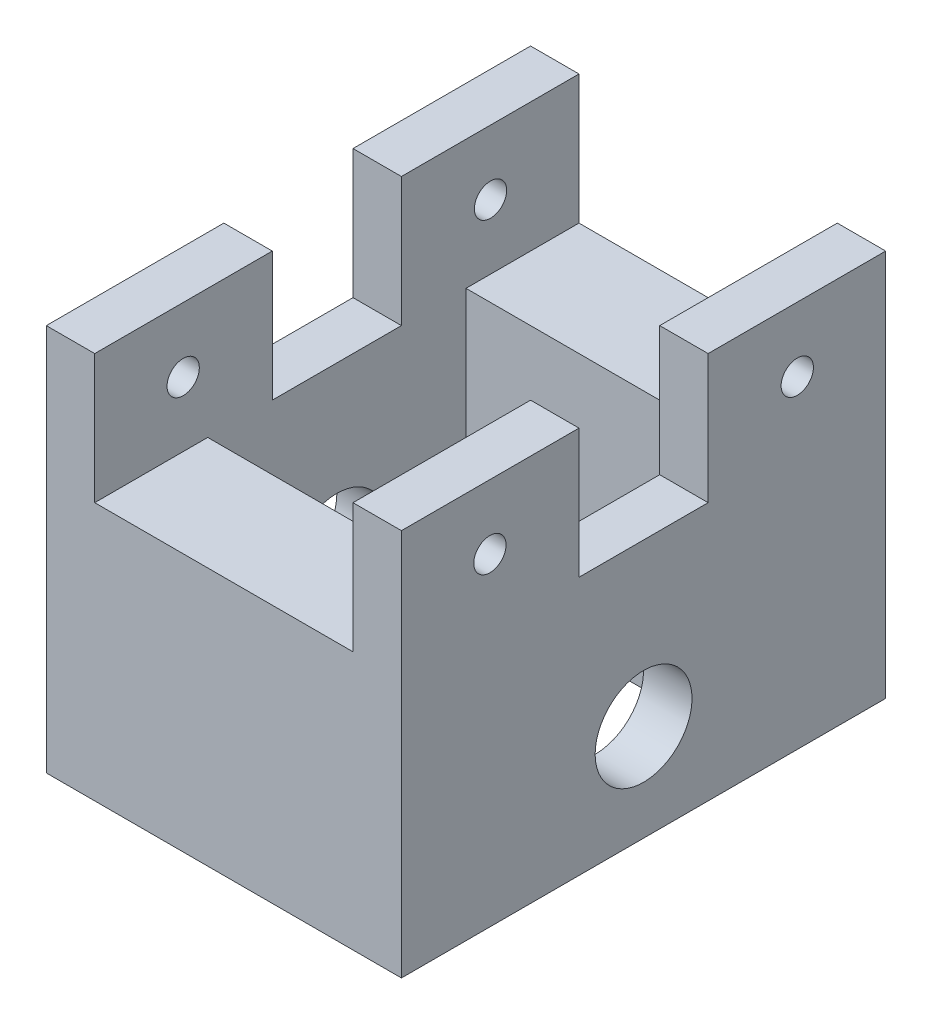
ISO-10303-21;
HEADER;
FILE_DESCRIPTION(('STEP AP214'),'2;1');
FILE_NAME('part.step','',(''),(''),'','','');
FILE_SCHEMA(('AUTOMOTIVE_DESIGN { 1 0 10303 214 1 1 1 1 }'));
ENDSEC;
DATA;
#1=APPLICATION_CONTEXT('core data for automotive mechanical design processes');
#2=APPLICATION_PROTOCOL_DEFINITION('international standard','automotive_design',2000,#1);
#3=PRODUCT_CONTEXT('',#1,'mechanical');
#4=PRODUCT('Part','Part','',(#3));
#5=PRODUCT_RELATED_PRODUCT_CATEGORY('part','',(#4));
#6=PRODUCT_DEFINITION_FORMATION('','',#4);
#7=PRODUCT_DEFINITION_CONTEXT('part definition',#1,'design');
#8=PRODUCT_DEFINITION('design','',#6,#7);
#9=PRODUCT_DEFINITION_SHAPE('','',#8);
#10=(LENGTH_UNIT() NAMED_UNIT(*) SI_UNIT(.MILLI.,.METRE.));
#11=(NAMED_UNIT(*) PLANE_ANGLE_UNIT() SI_UNIT($,.RADIAN.));
#12=(NAMED_UNIT(*) SI_UNIT($,.STERADIAN.) SOLID_ANGLE_UNIT());
#13=UNCERTAINTY_MEASURE_WITH_UNIT(LENGTH_MEASURE(1.E-05),#10,'distance_accuracy_value','');
#14=(GEOMETRIC_REPRESENTATION_CONTEXT(3) GLOBAL_UNCERTAINTY_ASSIGNED_CONTEXT((#13)) GLOBAL_UNIT_ASSIGNED_CONTEXT((#10,
#11,#12)) REPRESENTATION_CONTEXT('',''));
#15=CARTESIAN_POINT('',(0.,0.,0.));
#16=DIRECTION('',(0.,0.,1.));
#17=DIRECTION('',(1.,0.,0.));
#18=AXIS2_PLACEMENT_3D('',#15,#16,#17);
#19=CARTESIAN_POINT('',(0.,152.4,0.));
#20=DIRECTION('',(0.,1.,0.));
#21=DIRECTION('',(0.,0.,1.));
#22=AXIS2_PLACEMENT_3D('',#19,#20,#21);
#23=PLANE('',#22);
#24=DIRECTION('',(-1.,0.,0.));
#25=VECTOR('',#24,1.);
#26=CARTESIAN_POINT('',(69.85,152.4,-25.4));
#27=LINE('',#26,#25);
#28=CARTESIAN_POINT('',(-50.8,152.4,-25.4));
#29=VERTEX_POINT('',#28);
#30=CARTESIAN_POINT('',(-69.85,152.4,-25.4));
#31=VERTEX_POINT('',#30);
#32=EDGE_CURVE('E384',#29,#31,#27,.T.);
#33=ORIENTED_EDGE('',*,*,#32,.F.);
#34=DIRECTION('',(0.,0.,1.));
#35=VECTOR('',#34,1.);
#36=CARTESIAN_POINT('',(-50.8,152.4,76.2));
#37=LINE('',#36,#35);
#38=CARTESIAN_POINT('',(-50.8,152.4,-95.25));
#39=VERTEX_POINT('',#38);
#40=EDGE_CURVE('E322',#39,#29,#37,.T.);
#41=ORIENTED_EDGE('',*,*,#40,.F.);
#42=DIRECTION('',(-1.,0.,0.));
#43=VECTOR('',#42,1.);
#44=CARTESIAN_POINT('',(0.,152.4,-95.25));
#45=LINE('',#44,#43);
#46=CARTESIAN_POINT('',(-69.85,152.4,-95.25));
#47=VERTEX_POINT('',#46);
#48=EDGE_CURVE('E333',#39,#47,#45,.T.);
#49=ORIENTED_EDGE('',*,*,#48,.T.);
#50=DIRECTION('',(0.,0.,1.));
#51=VECTOR('',#50,1.);
#52=CARTESIAN_POINT('',(-69.85,152.4,0.));
#53=LINE('',#52,#51);
#54=EDGE_CURVE('E338',#47,#31,#53,.T.);
#55=ORIENTED_EDGE('',*,*,#54,.T.);
#56=EDGE_LOOP('',(#33,#41,#49,#55));
#57=FACE_BOUND('',#56,.T.);
#58=ADVANCED_FACE('F65',(#57),#23,.T.);
#59=CARTESIAN_POINT('',(69.85,152.4,-25.4));
#60=VERTEX_POINT('',#59);
#61=CARTESIAN_POINT('',(50.8,152.4,-25.4));
#62=VERTEX_POINT('',#61);
#63=EDGE_CURVE('E216',#60,#62,#27,.T.);
#64=ORIENTED_EDGE('',*,*,#63,.F.);
#65=DIRECTION('',(0.,0.,-1.));
#66=VECTOR('',#65,1.);
#67=CARTESIAN_POINT('',(69.85,152.4,0.));
#68=LINE('',#67,#66);
#69=CARTESIAN_POINT('',(69.85,152.4,-95.25));
#70=VERTEX_POINT('',#69);
#71=EDGE_CURVE('E334',#60,#70,#68,.T.);
#72=ORIENTED_EDGE('',*,*,#71,.T.);
#73=CARTESIAN_POINT('',(50.8,152.4,-95.25));
#74=VERTEX_POINT('',#73);
#75=EDGE_CURVE('E335',#70,#74,#45,.T.);
#76=ORIENTED_EDGE('',*,*,#75,.T.);
#77=DIRECTION('',(0.,0.,-1.));
#78=VECTOR('',#77,1.);
#79=CARTESIAN_POINT('',(50.8,152.4,76.2));
#80=LINE('',#79,#78);
#81=EDGE_CURVE('E321',#62,#74,#80,.T.);
#82=ORIENTED_EDGE('',*,*,#81,.F.);
#83=EDGE_LOOP('',(#64,#72,#76,#82));
#84=FACE_BOUND('',#83,.T.);
#85=ADVANCED_FACE('F397',(#84),#23,.T.);
#86=DIRECTION('',(1.,0.,0.));
#87=VECTOR('',#86,1.);
#88=CARTESIAN_POINT('',(69.85,152.4,25.4));
#89=LINE('',#88,#87);
#90=CARTESIAN_POINT('',(-69.85,152.4,25.4));
#91=VERTEX_POINT('',#90);
#92=CARTESIAN_POINT('',(-50.8,152.4,25.4));
#93=VERTEX_POINT('',#92);
#94=EDGE_CURVE('E382',#91,#93,#89,.T.);
#95=ORIENTED_EDGE('',*,*,#94,.F.);
#96=CARTESIAN_POINT('',(-69.85,152.4,95.25));
#97=VERTEX_POINT('',#96);
#98=EDGE_CURVE('E222',#91,#97,#53,.T.);
#99=ORIENTED_EDGE('',*,*,#98,.T.);
#100=DIRECTION('',(1.,0.,0.));
#101=VECTOR('',#100,1.);
#102=CARTESIAN_POINT('',(0.,152.4,95.25));
#103=LINE('',#102,#101);
#104=CARTESIAN_POINT('',(-50.8,152.4,95.25));
#105=VERTEX_POINT('',#104);
#106=EDGE_CURVE('E342',#97,#105,#103,.T.);
#107=ORIENTED_EDGE('',*,*,#106,.T.);
#108=EDGE_CURVE('E320',#93,#105,#37,.T.);
#109=ORIENTED_EDGE('',*,*,#108,.F.);
#110=EDGE_LOOP('',(#95,#99,#107,#109));
#111=FACE_BOUND('',#110,.T.);
#112=ADVANCED_FACE('F454',(#111),#23,.T.);
#113=CARTESIAN_POINT('',(50.8,152.4,25.4));
#114=VERTEX_POINT('',#113);
#115=CARTESIAN_POINT('',(69.85,152.4,25.4));
#116=VERTEX_POINT('',#115);
#117=EDGE_CURVE('E385',#114,#116,#89,.T.);
#118=ORIENTED_EDGE('',*,*,#117,.F.);
#119=CARTESIAN_POINT('',(50.8,152.4,95.25));
#120=VERTEX_POINT('',#119);
#121=EDGE_CURVE('E317',#120,#114,#80,.T.);
#122=ORIENTED_EDGE('',*,*,#121,.F.);
#123=CARTESIAN_POINT('',(69.85,152.4,95.25));
#124=VERTEX_POINT('',#123);
#125=EDGE_CURVE('E341',#120,#124,#103,.T.);
#126=ORIENTED_EDGE('',*,*,#125,.T.);
#127=EDGE_CURVE('E330',#124,#116,#68,.T.);
#128=ORIENTED_EDGE('',*,*,#127,.T.);
#129=EDGE_LOOP('',(#118,#122,#126,#128));
#130=FACE_BOUND('',#129,.T.);
#131=ADVANCED_FACE('F442',(#130),#23,.T.);
#132=CARTESIAN_POINT('',(0.,0.,0.));
#133=DIRECTION('',(0.,1.,0.));
#134=DIRECTION('',(0.,0.,1.));
#135=AXIS2_PLACEMENT_3D('',#132,#133,#134);
#136=PLANE('',#135);
#137=DIRECTION('',(0.,0.,-1.));
#138=VECTOR('',#137,1.);
#139=CARTESIAN_POINT('',(50.8,0.,76.2));
#140=LINE('',#139,#138);
#141=CARTESIAN_POINT('',(50.8,0.,50.8));
#142=VERTEX_POINT('',#141);
#143=CARTESIAN_POINT('',(50.8,0.,-50.8));
#144=VERTEX_POINT('',#143);
#145=EDGE_CURVE('E316',#142,#144,#140,.T.);
#146=ORIENTED_EDGE('',*,*,#145,.T.);
#147=DIRECTION('',(-1.,0.,0.));
#148=VECTOR('',#147,1.);
#149=CARTESIAN_POINT('',(-50.8,0.,-50.8));
#150=LINE('',#149,#148);
#151=CARTESIAN_POINT('',(-50.8,0.,-50.8));
#152=VERTEX_POINT('',#151);
#153=EDGE_CURVE('E243',#144,#152,#150,.T.);
#154=ORIENTED_EDGE('',*,*,#153,.T.);
#155=DIRECTION('',(0.,0.,1.));
#156=VECTOR('',#155,1.);
#157=CARTESIAN_POINT('',(-50.8,0.,76.2));
#158=LINE('',#157,#156);
#159=CARTESIAN_POINT('',(-50.8,0.,50.8));
#160=VERTEX_POINT('',#159);
#161=EDGE_CURVE('E328',#152,#160,#158,.T.);
#162=ORIENTED_EDGE('',*,*,#161,.T.);
#163=DIRECTION('',(1.,0.,0.));
#164=VECTOR('',#163,1.);
#165=CARTESIAN_POINT('',(-50.8,0.,50.8));
#166=LINE('',#165,#164);
#167=EDGE_CURVE('E250',#160,#142,#166,.T.);
#168=ORIENTED_EDGE('',*,*,#167,.T.);
#169=EDGE_LOOP('',(#146,#154,#162,#168));
#170=FACE_BOUND('',#169,.T.);
#171=DIRECTION('',(0.,0.,1.));
#172=VECTOR('',#171,1.);
#173=CARTESIAN_POINT('',(-69.85,0.,0.));
#174=LINE('',#173,#172);
#175=CARTESIAN_POINT('',(-69.85,0.,-95.25));
#176=VERTEX_POINT('',#175);
#177=CARTESIAN_POINT('',(-69.85,0.,95.25));
#178=VERTEX_POINT('',#177);
#179=EDGE_CURVE('E350',#176,#178,#174,.T.);
#180=ORIENTED_EDGE('',*,*,#179,.F.);
#181=DIRECTION('',(-1.,0.,0.));
#182=VECTOR('',#181,1.);
#183=CARTESIAN_POINT('',(0.,0.,-95.25));
#184=LINE('',#183,#182);
#185=CARTESIAN_POINT('',(69.85,0.,-95.25));
#186=VERTEX_POINT('',#185);
#187=EDGE_CURVE('E348',#186,#176,#184,.T.);
#188=ORIENTED_EDGE('',*,*,#187,.F.);
#189=DIRECTION('',(0.,0.,-1.));
#190=VECTOR('',#189,1.);
#191=CARTESIAN_POINT('',(69.85,0.,0.));
#192=LINE('',#191,#190);
#193=CARTESIAN_POINT('',(69.85,0.,95.25));
#194=VERTEX_POINT('',#193);
#195=EDGE_CURVE('E325',#194,#186,#192,.T.);
#196=ORIENTED_EDGE('',*,*,#195,.F.);
#197=DIRECTION('',(1.,0.,0.));
#198=VECTOR('',#197,1.);
#199=CARTESIAN_POINT('',(0.,0.,95.25));
#200=LINE('',#199,#198);
#201=EDGE_CURVE('E352',#178,#194,#200,.T.);
#202=ORIENTED_EDGE('',*,*,#201,.F.);
#203=EDGE_LOOP('',(#180,#188,#196,#202));
#204=FACE_BOUND('',#203,.T.);
#205=ADVANCED_FACE('F422',(#170,#204),#136,.F.);
#206=CARTESIAN_POINT('',(69.85,152.4,0.));
#207=DIRECTION('',(-1.,0.,0.));
#208=DIRECTION('',(0.,0.,1.));
#209=AXIS2_PLACEMENT_3D('',#206,#207,#208);
#210=PLANE('',#209);
#211=ORIENTED_EDGE('',*,*,#71,.F.);
#212=DIRECTION('',(0.,1.,0.));
#213=VECTOR('',#212,1.);
#214=CARTESIAN_POINT('',(69.85,101.6,-25.4));
#215=LINE('',#214,#213);
#216=CARTESIAN_POINT('',(69.85,101.6,-25.4));
#217=VERTEX_POINT('',#216);
#218=EDGE_CURVE('E226',#217,#60,#215,.T.);
#219=ORIENTED_EDGE('',*,*,#218,.F.);
#220=DIRECTION('',(0.,0.,-1.));
#221=VECTOR('',#220,1.);
#222=CARTESIAN_POINT('',(69.85,101.6,25.4));
#223=LINE('',#222,#221);
#224=CARTESIAN_POINT('',(69.85,101.6,25.4));
#225=VERTEX_POINT('',#224);
#226=EDGE_CURVE('E205',#225,#217,#223,.T.);
#227=ORIENTED_EDGE('',*,*,#226,.F.);
#228=DIRECTION('',(0.,1.,0.));
#229=VECTOR('',#228,1.);
#230=CARTESIAN_POINT('',(69.85,101.6,25.4));
#231=LINE('',#230,#229);
#232=EDGE_CURVE('E223',#225,#116,#231,.T.);
#233=ORIENTED_EDGE('',*,*,#232,.T.);
#234=ORIENTED_EDGE('',*,*,#127,.F.);
#235=DIRECTION('',(0.,-1.,0.));
#236=VECTOR('',#235,1.);
#237=CARTESIAN_POINT('',(69.85,152.4,95.25));
#238=LINE('',#237,#236);
#239=EDGE_CURVE('E345',#124,#194,#238,.T.);
#240=ORIENTED_EDGE('',*,*,#239,.T.);
#241=ORIENTED_EDGE('',*,*,#195,.T.);
#242=DIRECTION('',(0.,-1.,0.));
#243=VECTOR('',#242,1.);
#244=CARTESIAN_POINT('',(69.85,152.4,-95.25));
#245=LINE('',#244,#243);
#246=EDGE_CURVE('E362',#70,#186,#245,.T.);
#247=ORIENTED_EDGE('',*,*,#246,.F.);
#248=EDGE_LOOP('',(#211,#219,#227,#233,#234,#240,#241,#247));
#249=FACE_BOUND('',#248,.T.);
#250=CARTESIAN_POINT('',(69.85,127.,60.452));
#251=DIRECTION('',(1.,0.,0.));
#252=DIRECTION('',(0.,0.,-1.));
#253=AXIS2_PLACEMENT_3D('',#250,#251,#252);
#254=CIRCLE('',#253,6.34999999999999);
#255=CARTESIAN_POINT('',(69.85,127.,54.102));
#256=VERTEX_POINT('',#255);
#257=EDGE_CURVE('E270',#256,#256,#254,.T.);
#258=ORIENTED_EDGE('',*,*,#257,.F.);
#259=EDGE_LOOP('',(#258));
#260=FACE_BOUND('',#259,.T.);
#261=CARTESIAN_POINT('',(69.85,127.,-60.452));
#262=DIRECTION('',(1.,0.,0.));
#263=DIRECTION('',(0.,0.,-1.));
#264=AXIS2_PLACEMENT_3D('',#261,#262,#263);
#265=CIRCLE('',#264,6.35);
#266=CARTESIAN_POINT('',(69.85,127.,-66.802));
#267=VERTEX_POINT('',#266);
#268=EDGE_CURVE('E273',#267,#267,#265,.T.);
#269=ORIENTED_EDGE('',*,*,#268,.F.);
#270=EDGE_LOOP('',(#269));
#271=FACE_BOUND('',#270,.T.);
#272=CARTESIAN_POINT('',(69.85,38.1,0.));
#273=DIRECTION('',(-1.,0.,0.));
#274=DIRECTION('',(0.,0.,1.));
#275=AXIS2_PLACEMENT_3D('',#272,#273,#274);
#276=CIRCLE('',#275,19.05);
#277=CARTESIAN_POINT('',(69.85,38.1,19.05));
#278=VERTEX_POINT('',#277);
#279=EDGE_CURVE('E286',#278,#278,#276,.T.);
#280=ORIENTED_EDGE('',*,*,#279,.T.);
#281=EDGE_LOOP('',(#280));
#282=FACE_BOUND('',#281,.T.);
#283=ADVANCED_FACE('F67',(#249,#260,#271,#282),#210,.F.);
#284=CARTESIAN_POINT('',(0.,152.4,-95.25));
#285=DIRECTION('',(0.,0.,1.));
#286=DIRECTION('',(1.,0.,0.));
#287=AXIS2_PLACEMENT_3D('',#284,#285,#286);
#288=PLANE('',#287);
#289=DIRECTION('',(0.,1.,0.));
#290=VECTOR('',#289,1.);
#291=CARTESIAN_POINT('',(-50.8,152.4,-95.25));
#292=LINE('',#291,#290);
#293=CARTESIAN_POINT('',(-50.8,101.6,-95.25));
#294=VERTEX_POINT('',#293);
#295=EDGE_CURVE('E295',#294,#39,#292,.T.);
#296=ORIENTED_EDGE('',*,*,#295,.F.);
#297=DIRECTION('',(-1.,0.,0.));
#298=VECTOR('',#297,1.);
#299=CARTESIAN_POINT('',(-50.8,101.6,-95.25));
#300=LINE('',#299,#298);
#301=CARTESIAN_POINT('',(50.8,101.6,-95.25));
#302=VERTEX_POINT('',#301);
#303=EDGE_CURVE('E299',#302,#294,#300,.T.);
#304=ORIENTED_EDGE('',*,*,#303,.F.);
#305=DIRECTION('',(0.,-1.,0.));
#306=VECTOR('',#305,1.);
#307=CARTESIAN_POINT('',(50.8,152.4,-95.25));
#308=LINE('',#307,#306);
#309=EDGE_CURVE('E293',#74,#302,#308,.T.);
#310=ORIENTED_EDGE('',*,*,#309,.F.);
#311=ORIENTED_EDGE('',*,*,#75,.F.);
#312=ORIENTED_EDGE('',*,*,#246,.T.);
#313=ORIENTED_EDGE('',*,*,#187,.T.);
#314=DIRECTION('',(0.,-1.,0.));
#315=VECTOR('',#314,1.);
#316=CARTESIAN_POINT('',(-69.85,152.4,-95.25));
#317=LINE('',#316,#315);
#318=EDGE_CURVE('E359',#47,#176,#317,.T.);
#319=ORIENTED_EDGE('',*,*,#318,.F.);
#320=ORIENTED_EDGE('',*,*,#48,.F.);
#321=EDGE_LOOP('',(#296,#304,#310,#311,#312,#313,#319,#320));
#322=FACE_BOUND('',#321,.T.);
#323=ADVANCED_FACE('F404',(#322),#288,.F.);
#324=CARTESIAN_POINT('',(-69.85,152.4,0.));
#325=DIRECTION('',(1.,0.,0.));
#326=DIRECTION('',(0.,0.,-1.));
#327=AXIS2_PLACEMENT_3D('',#324,#325,#326);
#328=PLANE('',#327);
#329=CARTESIAN_POINT('',(-69.85,38.1,0.));
#330=DIRECTION('',(1.,0.,0.));
#331=DIRECTION('',(0.,0.,-1.));
#332=AXIS2_PLACEMENT_3D('',#329,#330,#331);
#333=CIRCLE('',#332,19.05);
#334=CARTESIAN_POINT('',(-69.85,38.1,-19.05));
#335=VERTEX_POINT('',#334);
#336=EDGE_CURVE('E262',#335,#335,#333,.T.);
#337=ORIENTED_EDGE('',*,*,#336,.T.);
#338=EDGE_LOOP('',(#337));
#339=FACE_BOUND('',#338,.T.);
#340=DIRECTION('',(0.,0.,1.));
#341=VECTOR('',#340,1.);
#342=CARTESIAN_POINT('',(-69.85,101.6,25.4));
#343=LINE('',#342,#341);
#344=CARTESIAN_POINT('',(-69.85,101.6,-25.4));
#345=VERTEX_POINT('',#344);
#346=CARTESIAN_POINT('',(-69.85,101.6,25.4));
#347=VERTEX_POINT('',#346);
#348=EDGE_CURVE('E209',#345,#347,#343,.T.);
#349=ORIENTED_EDGE('',*,*,#348,.F.);
#350=DIRECTION('',(0.,1.,0.));
#351=VECTOR('',#350,1.);
#352=CARTESIAN_POINT('',(-69.85,101.6,-25.4));
#353=LINE('',#352,#351);
#354=EDGE_CURVE('E235',#345,#31,#353,.T.);
#355=ORIENTED_EDGE('',*,*,#354,.T.);
#356=ORIENTED_EDGE('',*,*,#54,.F.);
#357=ORIENTED_EDGE('',*,*,#318,.T.);
#358=ORIENTED_EDGE('',*,*,#179,.T.);
#359=DIRECTION('',(0.,-1.,0.));
#360=VECTOR('',#359,1.);
#361=CARTESIAN_POINT('',(-69.85,152.4,95.25));
#362=LINE('',#361,#360);
#363=EDGE_CURVE('E356',#97,#178,#362,.T.);
#364=ORIENTED_EDGE('',*,*,#363,.F.);
#365=ORIENTED_EDGE('',*,*,#98,.F.);
#366=DIRECTION('',(0.,1.,0.));
#367=VECTOR('',#366,1.);
#368=CARTESIAN_POINT('',(-69.85,101.6,25.4));
#369=LINE('',#368,#367);
#370=EDGE_CURVE('E201',#347,#91,#369,.T.);
#371=ORIENTED_EDGE('',*,*,#370,.F.);
#372=EDGE_LOOP('',(#349,#355,#356,#357,#358,#364,#365,#371));
#373=FACE_BOUND('',#372,.T.);
#374=CARTESIAN_POINT('',(-69.85,127.,60.452));
#375=DIRECTION('',(1.,0.,0.));
#376=DIRECTION('',(0.,0.,-1.));
#377=AXIS2_PLACEMENT_3D('',#374,#375,#376);
#378=CIRCLE('',#377,6.34999999999999);
#379=CARTESIAN_POINT('',(-69.85,127.,54.102));
#380=VERTEX_POINT('',#379);
#381=EDGE_CURVE('E266',#380,#380,#378,.T.);
#382=ORIENTED_EDGE('',*,*,#381,.T.);
#383=EDGE_LOOP('',(#382));
#384=FACE_BOUND('',#383,.T.);
#385=CARTESIAN_POINT('',(-69.85,127.,-60.452));
#386=DIRECTION('',(1.,0.,0.));
#387=DIRECTION('',(0.,0.,-1.));
#388=AXIS2_PLACEMENT_3D('',#385,#386,#387);
#389=CIRCLE('',#388,6.35);
#390=CARTESIAN_POINT('',(-69.85,127.,-66.802));
#391=VERTEX_POINT('',#390);
#392=EDGE_CURVE('E276',#391,#391,#389,.T.);
#393=ORIENTED_EDGE('',*,*,#392,.T.);
#394=EDGE_LOOP('',(#393));
#395=FACE_BOUND('',#394,.T.);
#396=ADVANCED_FACE('F219',(#339,#373,#384,#395),#328,.F.);
#397=CARTESIAN_POINT('',(0.,152.4,95.25));
#398=DIRECTION('',(0.,0.,-1.));
#399=DIRECTION('',(-1.,0.,0.));
#400=AXIS2_PLACEMENT_3D('',#397,#398,#399);
#401=PLANE('',#400);
#402=DIRECTION('',(-1.,0.,0.));
#403=VECTOR('',#402,1.);
#404=CARTESIAN_POINT('',(-50.8,101.6,95.25));
#405=LINE('',#404,#403);
#406=CARTESIAN_POINT('',(50.8,101.6,95.25));
#407=VERTEX_POINT('',#406);
#408=CARTESIAN_POINT('',(-50.8,101.6,95.25));
#409=VERTEX_POINT('',#408);
#410=EDGE_CURVE('E309',#407,#409,#405,.T.);
#411=ORIENTED_EDGE('',*,*,#410,.T.);
#412=DIRECTION('',(0.,1.,0.));
#413=VECTOR('',#412,1.);
#414=CARTESIAN_POINT('',(-50.8,-1.77051078523313,95.25));
#415=LINE('',#414,#413);
#416=EDGE_CURVE('E303',#409,#105,#415,.T.);
#417=ORIENTED_EDGE('',*,*,#416,.T.);
#418=ORIENTED_EDGE('',*,*,#106,.F.);
#419=ORIENTED_EDGE('',*,*,#363,.T.);
#420=ORIENTED_EDGE('',*,*,#201,.T.);
#421=ORIENTED_EDGE('',*,*,#239,.F.);
#422=ORIENTED_EDGE('',*,*,#125,.F.);
#423=DIRECTION('',(0.,1.,0.));
#424=VECTOR('',#423,1.);
#425=CARTESIAN_POINT('',(50.8,-1.77051078523313,95.25));
#426=LINE('',#425,#424);
#427=EDGE_CURVE('E307',#407,#120,#426,.T.);
#428=ORIENTED_EDGE('',*,*,#427,.F.);
#429=EDGE_LOOP('',(#411,#417,#418,#419,#420,#421,#422,#428));
#430=FACE_BOUND('',#429,.T.);
#431=ADVANCED_FACE('F437',(#430),#401,.F.);
#432=CARTESIAN_POINT('',(50.8,152.4,76.2));
#433=DIRECTION('',(-1.,0.,0.));
#434=DIRECTION('',(0.,0.,1.));
#435=AXIS2_PLACEMENT_3D('',#432,#433,#434);
#436=PLANE('',#435);
#437=DIRECTION('',(0.,-1.,0.));
#438=VECTOR('',#437,1.);
#439=CARTESIAN_POINT('',(50.8,152.4,-25.4));
#440=LINE('',#439,#438);
#441=CARTESIAN_POINT('',(50.8,101.6,-25.4));
#442=VERTEX_POINT('',#441);
#443=EDGE_CURVE('E237',#62,#442,#440,.T.);
#444=ORIENTED_EDGE('',*,*,#443,.F.);
#445=ORIENTED_EDGE('',*,*,#81,.T.);
#446=ORIENTED_EDGE('',*,*,#309,.T.);
#447=DIRECTION('',(0.,0.,1.));
#448=VECTOR('',#447,1.);
#449=CARTESIAN_POINT('',(50.8,101.6,-208.842253256989));
#450=LINE('',#449,#448);
#451=CARTESIAN_POINT('',(50.8,101.6,-50.8));
#452=VERTEX_POINT('',#451);
#453=EDGE_CURVE('E296',#302,#452,#450,.T.);
#454=ORIENTED_EDGE('',*,*,#453,.T.);
#455=DIRECTION('',(0.,-1.,0.));
#456=VECTOR('',#455,1.);
#457=CARTESIAN_POINT('',(50.8,206.326882890689,-50.8));
#458=LINE('',#457,#456);
#459=EDGE_CURVE('E240',#452,#144,#458,.T.);
#460=ORIENTED_EDGE('',*,*,#459,.T.);
#461=ORIENTED_EDGE('',*,*,#145,.F.);
#462=DIRECTION('',(0.,-1.,0.));
#463=VECTOR('',#462,1.);
#464=CARTESIAN_POINT('',(50.8,206.326882890689,50.8));
#465=LINE('',#464,#463);
#466=CARTESIAN_POINT('',(50.8,101.6,50.8));
#467=VERTEX_POINT('',#466);
#468=EDGE_CURVE('E256',#467,#142,#465,.T.);
#469=ORIENTED_EDGE('',*,*,#468,.F.);
#470=DIRECTION('',(0.,0.,1.));
#471=VECTOR('',#470,1.);
#472=CARTESIAN_POINT('',(50.8,101.6,76.2));
#473=LINE('',#472,#471);
#474=EDGE_CURVE('E304',#467,#407,#473,.T.);
#475=ORIENTED_EDGE('',*,*,#474,.T.);
#476=ORIENTED_EDGE('',*,*,#427,.T.);
#477=ORIENTED_EDGE('',*,*,#121,.T.);
#478=DIRECTION('',(0.,1.,0.));
#479=VECTOR('',#478,1.);
#480=CARTESIAN_POINT('',(50.8,152.4,25.4));
#481=LINE('',#480,#479);
#482=CARTESIAN_POINT('',(50.8,101.6,25.4));
#483=VERTEX_POINT('',#482);
#484=EDGE_CURVE('E234',#483,#114,#481,.T.);
#485=ORIENTED_EDGE('',*,*,#484,.F.);
#486=DIRECTION('',(0.,0.,-1.));
#487=VECTOR('',#486,1.);
#488=CARTESIAN_POINT('',(50.8,101.6,76.2));
#489=LINE('',#488,#487);
#490=EDGE_CURVE('E231',#483,#442,#489,.T.);
#491=ORIENTED_EDGE('',*,*,#490,.T.);
#492=EDGE_LOOP('',(#444,#445,#446,#454,#460,#461,#469,#475,#476,#477,#485,#491));
#493=FACE_BOUND('',#492,.T.);
#494=CARTESIAN_POINT('',(50.8,127.,60.452));
#495=DIRECTION('',(-1.,0.,0.));
#496=DIRECTION('',(0.,0.,1.));
#497=AXIS2_PLACEMENT_3D('',#494,#495,#496);
#498=CIRCLE('',#497,6.34999999999999);
#499=CARTESIAN_POINT('',(50.8,127.,66.802));
#500=VERTEX_POINT('',#499);
#501=EDGE_CURVE('E283',#500,#500,#498,.T.);
#502=ORIENTED_EDGE('',*,*,#501,.F.);
#503=EDGE_LOOP('',(#502));
#504=FACE_BOUND('',#503,.T.);
#505=CARTESIAN_POINT('',(50.8,127.,-60.452));
#506=DIRECTION('',(-1.,0.,0.));
#507=DIRECTION('',(0.,0.,1.));
#508=AXIS2_PLACEMENT_3D('',#505,#506,#507);
#509=CIRCLE('',#508,6.35);
#510=CARTESIAN_POINT('',(50.8,127.,-54.102));
#511=VERTEX_POINT('',#510);
#512=EDGE_CURVE('E279',#511,#511,#509,.T.);
#513=ORIENTED_EDGE('',*,*,#512,.F.);
#514=EDGE_LOOP('',(#513));
#515=FACE_BOUND('',#514,.T.);
#516=CARTESIAN_POINT('',(50.8,38.1,0.));
#517=DIRECTION('',(-1.,0.,0.));
#518=DIRECTION('',(0.,0.,1.));
#519=AXIS2_PLACEMENT_3D('',#516,#517,#518);
#520=CIRCLE('',#519,19.05);
#521=CARTESIAN_POINT('',(50.8,38.1,19.05));
#522=VERTEX_POINT('',#521);
#523=EDGE_CURVE('E289',#522,#522,#520,.T.);
#524=ORIENTED_EDGE('',*,*,#523,.F.);
#525=EDGE_LOOP('',(#524));
#526=FACE_BOUND('',#525,.T.);
#527=ADVANCED_FACE('F410',(#493,#504,#515,#526),#436,.T.);
#528=CARTESIAN_POINT('',(-50.8,152.4,76.2));
#529=DIRECTION('',(1.,0.,0.));
#530=DIRECTION('',(0.,0.,-1.));
#531=AXIS2_PLACEMENT_3D('',#528,#529,#530);
#532=PLANE('',#531);
#533=DIRECTION('',(0.,1.,0.));
#534=VECTOR('',#533,1.);
#535=CARTESIAN_POINT('',(-50.8,152.4,-25.4));
#536=LINE('',#535,#534);
#537=CARTESIAN_POINT('',(-50.8,101.6,-25.4));
#538=VERTEX_POINT('',#537);
#539=EDGE_CURVE('E12',#538,#29,#536,.T.);
#540=ORIENTED_EDGE('',*,*,#539,.F.);
#541=DIRECTION('',(0.,0.,1.));
#542=VECTOR('',#541,1.);
#543=CARTESIAN_POINT('',(-50.8,101.6,76.2));
#544=LINE('',#543,#542);
#545=CARTESIAN_POINT('',(-50.8,101.6,25.4));
#546=VERTEX_POINT('',#545);
#547=EDGE_CURVE('E365',#538,#546,#544,.T.);
#548=ORIENTED_EDGE('',*,*,#547,.T.);
#549=DIRECTION('',(0.,-1.,0.));
#550=VECTOR('',#549,1.);
#551=CARTESIAN_POINT('',(-50.8,152.4,25.4));
#552=LINE('',#551,#550);
#553=EDGE_CURVE('E73',#93,#546,#552,.T.);
#554=ORIENTED_EDGE('',*,*,#553,.F.);
#555=ORIENTED_EDGE('',*,*,#108,.T.);
#556=ORIENTED_EDGE('',*,*,#416,.F.);
#557=DIRECTION('',(0.,0.,-1.));
#558=VECTOR('',#557,1.);
#559=CARTESIAN_POINT('',(-50.8,101.6,76.2));
#560=LINE('',#559,#558);
#561=CARTESIAN_POINT('',(-50.8,101.6,50.8));
#562=VERTEX_POINT('',#561);
#563=EDGE_CURVE('E306',#409,#562,#560,.T.);
#564=ORIENTED_EDGE('',*,*,#563,.T.);
#565=DIRECTION('',(0.,-1.,0.));
#566=VECTOR('',#565,1.);
#567=CARTESIAN_POINT('',(-50.8,206.326882890689,50.8));
#568=LINE('',#567,#566);
#569=EDGE_CURVE('E259',#562,#160,#568,.T.);
#570=ORIENTED_EDGE('',*,*,#569,.T.);
#571=ORIENTED_EDGE('',*,*,#161,.F.);
#572=DIRECTION('',(0.,-1.,0.));
#573=VECTOR('',#572,1.);
#574=CARTESIAN_POINT('',(-50.8,206.326882890689,-50.8));
#575=LINE('',#574,#573);
#576=CARTESIAN_POINT('',(-50.8,101.6,-50.8));
#577=VERTEX_POINT('',#576);
#578=EDGE_CURVE('E239',#577,#152,#575,.T.);
#579=ORIENTED_EDGE('',*,*,#578,.F.);
#580=DIRECTION('',(0.,0.,1.));
#581=VECTOR('',#580,1.);
#582=CARTESIAN_POINT('',(-50.8,101.6,-208.842253256989));
#583=LINE('',#582,#581);
#584=EDGE_CURVE('E292',#294,#577,#583,.T.);
#585=ORIENTED_EDGE('',*,*,#584,.F.);
#586=ORIENTED_EDGE('',*,*,#295,.T.);
#587=ORIENTED_EDGE('',*,*,#40,.T.);
#588=EDGE_LOOP('',(#540,#548,#554,#555,#556,#564,#570,#571,#579,#585,#586,#587));
#589=FACE_BOUND('',#588,.T.);
#590=CARTESIAN_POINT('',(-50.8,38.1,0.));
#591=DIRECTION('',(1.,0.,0.));
#592=DIRECTION('',(0.,0.,-1.));
#593=AXIS2_PLACEMENT_3D('',#590,#591,#592);
#594=CIRCLE('',#593,19.05);
#595=CARTESIAN_POINT('',(-50.8,38.1,-19.05));
#596=VERTEX_POINT('',#595);
#597=EDGE_CURVE('E265',#596,#596,#594,.T.);
#598=ORIENTED_EDGE('',*,*,#597,.F.);
#599=EDGE_LOOP('',(#598));
#600=FACE_BOUND('',#599,.T.);
#601=CARTESIAN_POINT('',(-50.8,127.,60.452));
#602=DIRECTION('',(1.,0.,0.));
#603=DIRECTION('',(0.,0.,-1.));
#604=AXIS2_PLACEMENT_3D('',#601,#602,#603);
#605=CIRCLE('',#604,6.34999999999999);
#606=CARTESIAN_POINT('',(-50.8,127.,54.102));
#607=VERTEX_POINT('',#606);
#608=EDGE_CURVE('E282',#607,#607,#605,.T.);
#609=ORIENTED_EDGE('',*,*,#608,.F.);
#610=EDGE_LOOP('',(#609));
#611=FACE_BOUND('',#610,.T.);
#612=CARTESIAN_POINT('',(-50.8,127.,-60.452));
#613=DIRECTION('',(1.,0.,0.));
#614=DIRECTION('',(0.,0.,-1.));
#615=AXIS2_PLACEMENT_3D('',#612,#613,#614);
#616=CIRCLE('',#615,6.35);
#617=CARTESIAN_POINT('',(-50.8,127.,-66.802));
#618=VERTEX_POINT('',#617);
#619=EDGE_CURVE('E269',#618,#618,#616,.T.);
#620=ORIENTED_EDGE('',*,*,#619,.F.);
#621=EDGE_LOOP('',(#620));
#622=FACE_BOUND('',#621,.T.);
#623=ADVANCED_FACE('F374',(#589,#600,#611,#622),#532,.T.);
#624=CARTESIAN_POINT('',(0.,101.6,0.));
#625=DIRECTION('',(0.,1.,0.));
#626=DIRECTION('',(0.,0.,1.));
#627=AXIS2_PLACEMENT_3D('',#624,#625,#626);
#628=PLANE('',#627);
#629=ORIENTED_EDGE('',*,*,#563,.F.);
#630=ORIENTED_EDGE('',*,*,#410,.F.);
#631=ORIENTED_EDGE('',*,*,#474,.F.);
#632=DIRECTION('',(1.,0.,0.));
#633=VECTOR('',#632,1.);
#634=CARTESIAN_POINT('',(-50.8,101.6,50.8));
#635=LINE('',#634,#633);
#636=EDGE_CURVE('E253',#562,#467,#635,.T.);
#637=ORIENTED_EDGE('',*,*,#636,.F.);
#638=EDGE_LOOP('',(#629,#630,#631,#637));
#639=FACE_BOUND('',#638,.T.);
#640=ADVANCED_FACE('F434',(#639),#628,.T.);
#641=CARTESIAN_POINT('',(-50.8,101.6,-208.842253256989));
#642=DIRECTION('',(0.,-1.,0.));
#643=DIRECTION('',(0.,0.,-1.));
#644=AXIS2_PLACEMENT_3D('',#641,#642,#643);
#645=PLANE('',#644);
#646=ORIENTED_EDGE('',*,*,#584,.T.);
#647=DIRECTION('',(-1.,0.,0.));
#648=VECTOR('',#647,1.);
#649=CARTESIAN_POINT('',(-50.8,101.6,-50.8));
#650=LINE('',#649,#648);
#651=EDGE_CURVE('E244',#452,#577,#650,.T.);
#652=ORIENTED_EDGE('',*,*,#651,.F.);
#653=ORIENTED_EDGE('',*,*,#453,.F.);
#654=ORIENTED_EDGE('',*,*,#303,.T.);
#655=EDGE_LOOP('',(#646,#652,#653,#654));
#656=FACE_BOUND('',#655,.T.);
#657=ADVANCED_FACE('F414',(#656),#645,.F.);
#658=CARTESIAN_POINT('',(69.85,38.1,0.));
#659=DIRECTION('',(-1.,0.,0.));
#660=DIRECTION('',(0.,0.,1.));
#661=AXIS2_PLACEMENT_3D('',#658,#659,#660);
#662=CYLINDRICAL_SURFACE('',#661,19.05);
#663=ORIENTED_EDGE('',*,*,#523,.T.);
#664=EDGE_LOOP('',(#663));
#665=FACE_BOUND('',#664,.T.);
#666=ORIENTED_EDGE('',*,*,#279,.F.);
#667=EDGE_LOOP('',(#666));
#668=FACE_BOUND('',#667,.T.);
#669=ADVANCED_FACE('F511',(#665,#668),#662,.F.);
#670=CARTESIAN_POINT('',(-69.85,127.,-60.452));
#671=DIRECTION('',(1.,0.,0.));
#672=DIRECTION('',(0.,0.,-1.));
#673=AXIS2_PLACEMENT_3D('',#670,#671,#672);
#674=CYLINDRICAL_SURFACE('',#673,6.35);
#675=ORIENTED_EDGE('',*,*,#619,.T.);
#676=EDGE_LOOP('',(#675));
#677=FACE_BOUND('',#676,.T.);
#678=ORIENTED_EDGE('',*,*,#392,.F.);
#679=EDGE_LOOP('',(#678));
#680=FACE_BOUND('',#679,.T.);
#681=ADVANCED_FACE('F577',(#677,#680),#674,.F.);
#682=CARTESIAN_POINT('',(-69.85,127.,60.452));
#683=DIRECTION('',(1.,0.,0.));
#684=DIRECTION('',(0.,0.,-1.));
#685=AXIS2_PLACEMENT_3D('',#682,#683,#684);
#686=CYLINDRICAL_SURFACE('',#685,6.34999999999999);
#687=ORIENTED_EDGE('',*,*,#608,.T.);
#688=EDGE_LOOP('',(#687));
#689=FACE_BOUND('',#688,.T.);
#690=ORIENTED_EDGE('',*,*,#381,.F.);
#691=EDGE_LOOP('',(#690));
#692=FACE_BOUND('',#691,.T.);
#693=ADVANCED_FACE('F565',(#689,#692),#686,.F.);
#694=ORIENTED_EDGE('',*,*,#512,.T.);
#695=EDGE_LOOP('',(#694));
#696=FACE_BOUND('',#695,.T.);
#697=ORIENTED_EDGE('',*,*,#268,.T.);
#698=EDGE_LOOP('',(#697));
#699=FACE_BOUND('',#698,.T.);
#700=ADVANCED_FACE('F562',(#696,#699),#674,.F.);
#701=ORIENTED_EDGE('',*,*,#501,.T.);
#702=EDGE_LOOP('',(#701));
#703=FACE_BOUND('',#702,.T.);
#704=ORIENTED_EDGE('',*,*,#257,.T.);
#705=EDGE_LOOP('',(#704));
#706=FACE_BOUND('',#705,.T.);
#707=ADVANCED_FACE('F539',(#703,#706),#686,.F.);
#708=CARTESIAN_POINT('',(-69.85,38.1,0.));
#709=DIRECTION('',(1.,0.,0.));
#710=DIRECTION('',(0.,0.,-1.));
#711=AXIS2_PLACEMENT_3D('',#708,#709,#710);
#712=CYLINDRICAL_SURFACE('',#711,19.05);
#713=ORIENTED_EDGE('',*,*,#597,.T.);
#714=EDGE_LOOP('',(#713));
#715=FACE_BOUND('',#714,.T.);
#716=ORIENTED_EDGE('',*,*,#336,.F.);
#717=EDGE_LOOP('',(#716));
#718=FACE_BOUND('',#717,.T.);
#719=ADVANCED_FACE('F500',(#715,#718),#712,.F.);
#720=CARTESIAN_POINT('',(-50.8,206.326882890689,50.8));
#721=DIRECTION('',(0.,0.,-1.));
#722=DIRECTION('',(-1.,0.,0.));
#723=AXIS2_PLACEMENT_3D('',#720,#721,#722);
#724=PLANE('',#723);
#725=ORIENTED_EDGE('',*,*,#569,.F.);
#726=ORIENTED_EDGE('',*,*,#636,.T.);
#727=ORIENTED_EDGE('',*,*,#468,.T.);
#728=ORIENTED_EDGE('',*,*,#167,.F.);
#729=EDGE_LOOP('',(#725,#726,#727,#728));
#730=FACE_BOUND('',#729,.T.);
#731=ADVANCED_FACE('F428',(#730),#724,.T.);
#732=CARTESIAN_POINT('',(-50.8,206.326882890689,-50.8));
#733=DIRECTION('',(0.,0.,1.));
#734=DIRECTION('',(1.,0.,0.));
#735=AXIS2_PLACEMENT_3D('',#732,#733,#734);
#736=PLANE('',#735);
#737=ORIENTED_EDGE('',*,*,#459,.F.);
#738=ORIENTED_EDGE('',*,*,#651,.T.);
#739=ORIENTED_EDGE('',*,*,#578,.T.);
#740=ORIENTED_EDGE('',*,*,#153,.F.);
#741=EDGE_LOOP('',(#737,#738,#739,#740));
#742=FACE_BOUND('',#741,.T.);
#743=ADVANCED_FACE('F419',(#742),#736,.T.);
#744=CARTESIAN_POINT('',(0.,101.6,0.));
#745=DIRECTION('',(0.,1.,0.));
#746=DIRECTION('',(0.,0.,1.));
#747=AXIS2_PLACEMENT_3D('',#744,#745,#746);
#748=PLANE('',#747);
#749=DIRECTION('',(-1.,0.,0.));
#750=VECTOR('',#749,1.);
#751=CARTESIAN_POINT('',(69.85,101.6,-25.4));
#752=LINE('',#751,#750);
#753=EDGE_CURVE('E212',#538,#345,#752,.T.);
#754=ORIENTED_EDGE('',*,*,#753,.T.);
#755=ORIENTED_EDGE('',*,*,#348,.T.);
#756=DIRECTION('',(1.,0.,0.));
#757=VECTOR('',#756,1.);
#758=CARTESIAN_POINT('',(69.85,101.6,25.4));
#759=LINE('',#758,#757);
#760=EDGE_CURVE('E88',#347,#546,#759,.T.);
#761=ORIENTED_EDGE('',*,*,#760,.T.);
#762=ORIENTED_EDGE('',*,*,#547,.F.);
#763=EDGE_LOOP('',(#754,#755,#761,#762));
#764=FACE_BOUND('',#763,.T.);
#765=ADVANCED_FACE('F210',(#764),#748,.T.);
#766=CARTESIAN_POINT('',(69.85,101.6,25.4));
#767=DIRECTION('',(0.,0.,1.));
#768=DIRECTION('',(1.,0.,0.));
#769=AXIS2_PLACEMENT_3D('',#766,#767,#768);
#770=PLANE('',#769);
#771=ORIENTED_EDGE('',*,*,#553,.T.);
#772=ORIENTED_EDGE('',*,*,#760,.F.);
#773=ORIENTED_EDGE('',*,*,#370,.T.);
#774=ORIENTED_EDGE('',*,*,#94,.T.);
#775=EDGE_LOOP('',(#771,#772,#773,#774));
#776=FACE_BOUND('',#775,.T.);
#777=ADVANCED_FACE('F199',(#776),#770,.F.);
#778=CARTESIAN_POINT('',(69.85,101.6,-25.4));
#779=DIRECTION('',(0.,0.,-1.));
#780=DIRECTION('',(-1.,0.,0.));
#781=AXIS2_PLACEMENT_3D('',#778,#779,#780);
#782=PLANE('',#781);
#783=ORIENTED_EDGE('',*,*,#539,.T.);
#784=ORIENTED_EDGE('',*,*,#32,.T.);
#785=ORIENTED_EDGE('',*,*,#354,.F.);
#786=ORIENTED_EDGE('',*,*,#753,.F.);
#787=EDGE_LOOP('',(#783,#784,#785,#786));
#788=FACE_BOUND('',#787,.T.);
#789=ADVANCED_FACE('F378',(#788),#782,.F.);
#790=ORIENTED_EDGE('',*,*,#443,.T.);
#791=EDGE_CURVE('E80',#217,#442,#752,.T.);
#792=ORIENTED_EDGE('',*,*,#791,.F.);
#793=ORIENTED_EDGE('',*,*,#218,.T.);
#794=ORIENTED_EDGE('',*,*,#63,.T.);
#795=EDGE_LOOP('',(#790,#792,#793,#794));
#796=FACE_BOUND('',#795,.T.);
#797=ADVANCED_FACE('F390',(#796),#782,.F.);
#798=ORIENTED_EDGE('',*,*,#484,.T.);
#799=ORIENTED_EDGE('',*,*,#117,.T.);
#800=ORIENTED_EDGE('',*,*,#232,.F.);
#801=EDGE_CURVE('E206',#483,#225,#759,.T.);
#802=ORIENTED_EDGE('',*,*,#801,.F.);
#803=EDGE_LOOP('',(#798,#799,#800,#802));
#804=FACE_BOUND('',#803,.T.);
#805=ADVANCED_FACE('F446',(#804),#770,.F.);
#806=ORIENTED_EDGE('',*,*,#801,.T.);
#807=ORIENTED_EDGE('',*,*,#226,.T.);
#808=ORIENTED_EDGE('',*,*,#791,.T.);
#809=ORIENTED_EDGE('',*,*,#490,.F.);
#810=EDGE_LOOP('',(#806,#807,#808,#809));
#811=FACE_BOUND('',#810,.T.);
#812=ADVANCED_FACE('F448',(#811),#748,.T.);
#813=CLOSED_SHELL('',(#58,#85,#112,#131,#205,#283,#323,#396,#431,#527,#623,#640,#657,#669,#681,
#693,#700,#707,#719,#731,#743,#765,#777,#789,#797,#805,#812));
#814=MANIFOLD_SOLID_BREP('B2',#813);
#815=ADVANCED_BREP_SHAPE_REPRESENTATION('',(#18,#814),#14);
#816=SHAPE_DEFINITION_REPRESENTATION(#9,#815);
ENDSEC;
END-ISO-10303-21;
